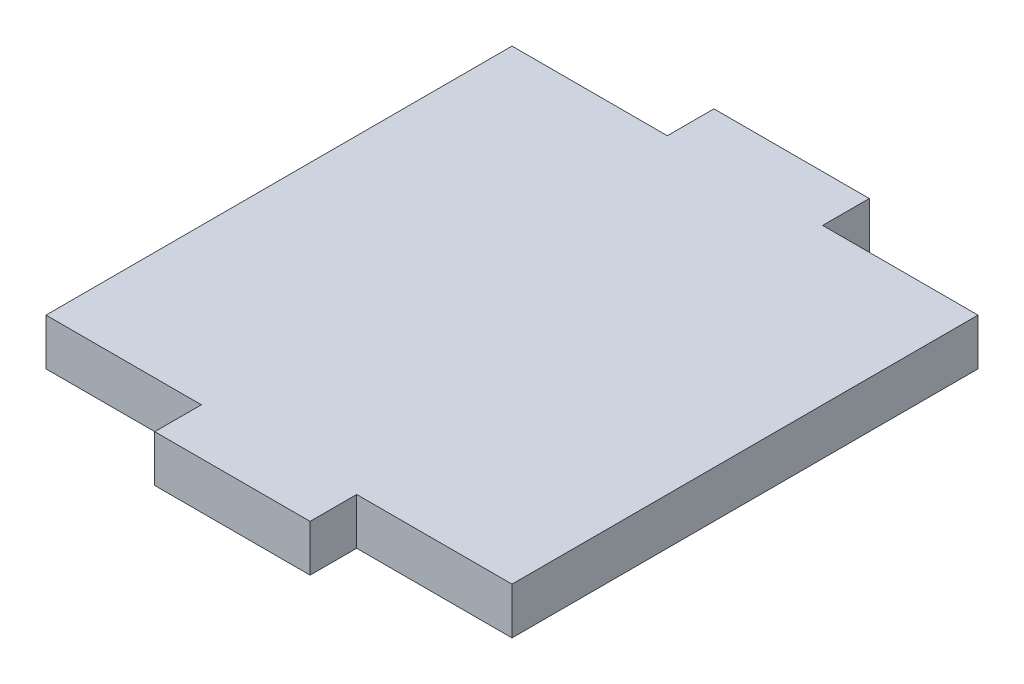
ISO-10303-21;
HEADER;
FILE_DESCRIPTION(('STEP AP214'),'2;1');
FILE_NAME('part.step','',(''),(''),'','','');
FILE_SCHEMA(('AUTOMOTIVE_DESIGN { 1 0 10303 214 1 1 1 1 }'));
ENDSEC;
DATA;
#1=APPLICATION_CONTEXT('core data for automotive mechanical design processes');
#2=APPLICATION_PROTOCOL_DEFINITION('international standard','automotive_design',2000,#1);
#3=PRODUCT_CONTEXT('',#1,'mechanical');
#4=PRODUCT('Part','Part','',(#3));
#5=PRODUCT_RELATED_PRODUCT_CATEGORY('part','',(#4));
#6=PRODUCT_DEFINITION_FORMATION('','',#4);
#7=PRODUCT_DEFINITION_CONTEXT('part definition',#1,'design');
#8=PRODUCT_DEFINITION('design','',#6,#7);
#9=PRODUCT_DEFINITION_SHAPE('','',#8);
#10=(LENGTH_UNIT() NAMED_UNIT(*) SI_UNIT(.MILLI.,.METRE.));
#11=(NAMED_UNIT(*) PLANE_ANGLE_UNIT() SI_UNIT($,.RADIAN.));
#12=(NAMED_UNIT(*) SI_UNIT($,.STERADIAN.) SOLID_ANGLE_UNIT());
#13=UNCERTAINTY_MEASURE_WITH_UNIT(LENGTH_MEASURE(1.E-05),#10,'distance_accuracy_value','');
#14=(GEOMETRIC_REPRESENTATION_CONTEXT(3) GLOBAL_UNCERTAINTY_ASSIGNED_CONTEXT((#13)) GLOBAL_UNIT_ASSIGNED_CONTEXT((#10,
#11,#12)) REPRESENTATION_CONTEXT('',''));
#15=CARTESIAN_POINT('',(0.,0.,0.));
#16=DIRECTION('',(0.,0.,1.));
#17=DIRECTION('',(1.,0.,0.));
#18=AXIS2_PLACEMENT_3D('',#15,#16,#17);
#19=CARTESIAN_POINT('',(4.99999999999999,3.,-15.));
#20=DIRECTION('',(0.,0.,1.));
#21=DIRECTION('',(1.,0.,0.));
#22=AXIS2_PLACEMENT_3D('',#19,#20,#21);
#23=PLANE('',#22);
#24=DIRECTION('',(-1.,0.,0.));
#25=VECTOR('',#24,1.);
#26=CARTESIAN_POINT('',(4.99999999999999,0.,-15.));
#27=LINE('',#26,#25);
#28=CARTESIAN_POINT('',(15.,0.,-15.));
#29=VERTEX_POINT('',#28);
#30=CARTESIAN_POINT('',(4.99999999999999,0.,-15.));
#31=VERTEX_POINT('',#30);
#32=EDGE_CURVE('E154',#29,#31,#27,.T.);
#33=ORIENTED_EDGE('',*,*,#32,.T.);
#34=DIRECTION('',(0.,-1.,0.));
#35=VECTOR('',#34,1.);
#36=CARTESIAN_POINT('',(4.99999999999999,3.,-15.));
#37=LINE('',#36,#35);
#38=CARTESIAN_POINT('',(4.99999999999999,3.,-15.));
#39=VERTEX_POINT('',#38);
#40=EDGE_CURVE('E11',#39,#31,#37,.T.);
#41=ORIENTED_EDGE('',*,*,#40,.F.);
#42=DIRECTION('',(-1.,0.,0.));
#43=VECTOR('',#42,1.);
#44=CARTESIAN_POINT('',(4.99999999999999,3.,-15.));
#45=LINE('',#44,#43);
#46=CARTESIAN_POINT('',(15.,3.,-15.));
#47=VERTEX_POINT('',#46);
#48=EDGE_CURVE('E176',#47,#39,#45,.T.);
#49=ORIENTED_EDGE('',*,*,#48,.F.);
#50=DIRECTION('',(0.,-1.,0.));
#51=VECTOR('',#50,1.);
#52=CARTESIAN_POINT('',(15.,3.,-15.));
#53=LINE('',#52,#51);
#54=EDGE_CURVE('E150',#47,#29,#53,.T.);
#55=ORIENTED_EDGE('',*,*,#54,.T.);
#56=EDGE_LOOP('',(#33,#41,#49,#55));
#57=FACE_BOUND('',#56,.T.);
#58=ADVANCED_FACE('F34',(#57),#23,.F.);
#59=CARTESIAN_POINT('',(4.99999999999999,3.,-15.));
#60=DIRECTION('',(-1.,0.,0.));
#61=DIRECTION('',(0.,0.,1.));
#62=AXIS2_PLACEMENT_3D('',#59,#60,#61);
#63=PLANE('',#62);
#64=DIRECTION('',(0.,0.,-1.));
#65=VECTOR('',#64,1.);
#66=CARTESIAN_POINT('',(4.99999999999999,0.,-15.));
#67=LINE('',#66,#65);
#68=CARTESIAN_POINT('',(4.99999999999999,0.,-18.));
#69=VERTEX_POINT('',#68);
#70=EDGE_CURVE('E157',#31,#69,#67,.T.);
#71=ORIENTED_EDGE('',*,*,#70,.T.);
#72=DIRECTION('',(0.,-1.,0.));
#73=VECTOR('',#72,1.);
#74=CARTESIAN_POINT('',(4.99999999999999,3.,-18.));
#75=LINE('',#74,#73);
#76=CARTESIAN_POINT('',(4.99999999999999,3.,-18.));
#77=VERTEX_POINT('',#76);
#78=EDGE_CURVE('E42',#77,#69,#75,.T.);
#79=ORIENTED_EDGE('',*,*,#78,.F.);
#80=DIRECTION('',(0.,0.,-1.));
#81=VECTOR('',#80,1.);
#82=CARTESIAN_POINT('',(4.99999999999999,3.,-15.));
#83=LINE('',#82,#81);
#84=EDGE_CURVE('E105',#39,#77,#83,.T.);
#85=ORIENTED_EDGE('',*,*,#84,.F.);
#86=ORIENTED_EDGE('',*,*,#40,.T.);
#87=EDGE_LOOP('',(#71,#79,#85,#86));
#88=FACE_BOUND('',#87,.T.);
#89=ADVANCED_FACE('F254',(#88),#63,.F.);
#90=CARTESIAN_POINT('',(4.99999999999999,3.,-18.));
#91=DIRECTION('',(0.,0.,1.));
#92=DIRECTION('',(1.,0.,0.));
#93=AXIS2_PLACEMENT_3D('',#90,#91,#92);
#94=PLANE('',#93);
#95=DIRECTION('',(-1.,0.,0.));
#96=VECTOR('',#95,1.);
#97=CARTESIAN_POINT('',(4.99999999999999,0.,-18.));
#98=LINE('',#97,#96);
#99=CARTESIAN_POINT('',(-5.00000000000001,0.,-18.));
#100=VERTEX_POINT('',#99);
#101=EDGE_CURVE('E159',#69,#100,#98,.T.);
#102=ORIENTED_EDGE('',*,*,#101,.T.);
#103=DIRECTION('',(0.,-1.,0.));
#104=VECTOR('',#103,1.);
#105=CARTESIAN_POINT('',(-5.00000000000001,3.,-18.));
#106=LINE('',#105,#104);
#107=CARTESIAN_POINT('',(-5.00000000000001,3.,-18.));
#108=VERTEX_POINT('',#107);
#109=EDGE_CURVE('E195',#108,#100,#106,.T.);
#110=ORIENTED_EDGE('',*,*,#109,.F.);
#111=DIRECTION('',(-1.,0.,0.));
#112=VECTOR('',#111,1.);
#113=CARTESIAN_POINT('',(4.99999999999999,3.,-18.));
#114=LINE('',#113,#112);
#115=EDGE_CURVE('E203',#77,#108,#114,.T.);
#116=ORIENTED_EDGE('',*,*,#115,.F.);
#117=ORIENTED_EDGE('',*,*,#78,.T.);
#118=EDGE_LOOP('',(#102,#110,#116,#117));
#119=FACE_BOUND('',#118,.T.);
#120=ADVANCED_FACE('F201',(#119),#94,.F.);
#121=CARTESIAN_POINT('',(-5.00000000000001,3.,-18.));
#122=DIRECTION('',(1.,0.,0.));
#123=DIRECTION('',(0.,0.,-1.));
#124=AXIS2_PLACEMENT_3D('',#121,#122,#123);
#125=PLANE('',#124);
#126=DIRECTION('',(0.,0.,1.));
#127=VECTOR('',#126,1.);
#128=CARTESIAN_POINT('',(-5.00000000000001,0.,-18.));
#129=LINE('',#128,#127);
#130=CARTESIAN_POINT('',(-5.00000000000001,0.,-15.));
#131=VERTEX_POINT('',#130);
#132=EDGE_CURVE('E161',#100,#131,#129,.T.);
#133=ORIENTED_EDGE('',*,*,#132,.T.);
#134=DIRECTION('',(0.,-1.,0.));
#135=VECTOR('',#134,1.);
#136=CARTESIAN_POINT('',(-5.00000000000001,3.,-15.));
#137=LINE('',#136,#135);
#138=CARTESIAN_POINT('',(-5.00000000000001,3.,-15.));
#139=VERTEX_POINT('',#138);
#140=EDGE_CURVE('E192',#139,#131,#137,.T.);
#141=ORIENTED_EDGE('',*,*,#140,.F.);
#142=DIRECTION('',(0.,0.,1.));
#143=VECTOR('',#142,1.);
#144=CARTESIAN_POINT('',(-5.00000000000001,3.,-18.));
#145=LINE('',#144,#143);
#146=EDGE_CURVE('E221',#108,#139,#145,.T.);
#147=ORIENTED_EDGE('',*,*,#146,.F.);
#148=ORIENTED_EDGE('',*,*,#109,.T.);
#149=EDGE_LOOP('',(#133,#141,#147,#148));
#150=FACE_BOUND('',#149,.T.);
#151=ADVANCED_FACE('F212',(#150),#125,.F.);
#152=CARTESIAN_POINT('',(-15.,3.,-15.));
#153=DIRECTION('',(0.,0.,1.));
#154=DIRECTION('',(1.,0.,0.));
#155=AXIS2_PLACEMENT_3D('',#152,#153,#154);
#156=PLANE('',#155);
#157=DIRECTION('',(-1.,0.,0.));
#158=VECTOR('',#157,1.);
#159=CARTESIAN_POINT('',(-15.,0.,-15.));
#160=LINE('',#159,#158);
#161=CARTESIAN_POINT('',(-15.,0.,-15.));
#162=VERTEX_POINT('',#161);
#163=EDGE_CURVE('E163',#131,#162,#160,.T.);
#164=ORIENTED_EDGE('',*,*,#163,.T.);
#165=DIRECTION('',(0.,-1.,0.));
#166=VECTOR('',#165,1.);
#167=CARTESIAN_POINT('',(-15.,3.,-15.));
#168=LINE('',#167,#166);
#169=CARTESIAN_POINT('',(-15.,3.,-15.));
#170=VERTEX_POINT('',#169);
#171=EDGE_CURVE('E189',#170,#162,#168,.T.);
#172=ORIENTED_EDGE('',*,*,#171,.F.);
#173=DIRECTION('',(-1.,0.,0.));
#174=VECTOR('',#173,1.);
#175=CARTESIAN_POINT('',(-15.,3.,-15.));
#176=LINE('',#175,#174);
#177=EDGE_CURVE('E218',#139,#170,#176,.T.);
#178=ORIENTED_EDGE('',*,*,#177,.F.);
#179=ORIENTED_EDGE('',*,*,#140,.T.);
#180=EDGE_LOOP('',(#164,#172,#178,#179));
#181=FACE_BOUND('',#180,.T.);
#182=ADVANCED_FACE('F216',(#181),#156,.F.);
#183=CARTESIAN_POINT('',(-15.,3.,15.));
#184=DIRECTION('',(1.,0.,0.));
#185=DIRECTION('',(0.,0.,-1.));
#186=AXIS2_PLACEMENT_3D('',#183,#184,#185);
#187=PLANE('',#186);
#188=DIRECTION('',(0.,0.,1.));
#189=VECTOR('',#188,1.);
#190=CARTESIAN_POINT('',(-15.,0.,15.));
#191=LINE('',#190,#189);
#192=CARTESIAN_POINT('',(-15.,0.,15.));
#193=VERTEX_POINT('',#192);
#194=EDGE_CURVE('E165',#162,#193,#191,.T.);
#195=ORIENTED_EDGE('',*,*,#194,.T.);
#196=DIRECTION('',(0.,-1.,0.));
#197=VECTOR('',#196,1.);
#198=CARTESIAN_POINT('',(-15.,3.,15.));
#199=LINE('',#198,#197);
#200=CARTESIAN_POINT('',(-15.,3.,15.));
#201=VERTEX_POINT('',#200);
#202=EDGE_CURVE('E186',#201,#193,#199,.T.);
#203=ORIENTED_EDGE('',*,*,#202,.F.);
#204=DIRECTION('',(0.,0.,1.));
#205=VECTOR('',#204,1.);
#206=CARTESIAN_POINT('',(-15.,3.,15.));
#207=LINE('',#206,#205);
#208=EDGE_CURVE('E220',#170,#201,#207,.T.);
#209=ORIENTED_EDGE('',*,*,#208,.F.);
#210=ORIENTED_EDGE('',*,*,#171,.T.);
#211=EDGE_LOOP('',(#195,#203,#209,#210));
#212=FACE_BOUND('',#211,.T.);
#213=ADVANCED_FACE('F267',(#212),#187,.F.);
#214=CARTESIAN_POINT('',(-15.,3.,15.));
#215=DIRECTION('',(0.,0.,-1.));
#216=DIRECTION('',(-1.,0.,0.));
#217=AXIS2_PLACEMENT_3D('',#214,#215,#216);
#218=PLANE('',#217);
#219=DIRECTION('',(1.,0.,0.));
#220=VECTOR('',#219,1.);
#221=CARTESIAN_POINT('',(-15.,0.,15.));
#222=LINE('',#221,#220);
#223=CARTESIAN_POINT('',(-4.99999999999999,0.,15.));
#224=VERTEX_POINT('',#223);
#225=EDGE_CURVE('E167',#193,#224,#222,.T.);
#226=ORIENTED_EDGE('',*,*,#225,.T.);
#227=DIRECTION('',(0.,-1.,0.));
#228=VECTOR('',#227,1.);
#229=CARTESIAN_POINT('',(-4.99999999999999,3.,15.));
#230=LINE('',#229,#228);
#231=CARTESIAN_POINT('',(-4.99999999999999,3.,15.));
#232=VERTEX_POINT('',#231);
#233=EDGE_CURVE('E183',#232,#224,#230,.T.);
#234=ORIENTED_EDGE('',*,*,#233,.F.);
#235=DIRECTION('',(1.,0.,0.));
#236=VECTOR('',#235,1.);
#237=CARTESIAN_POINT('',(-15.,3.,15.));
#238=LINE('',#237,#236);
#239=EDGE_CURVE('E223',#201,#232,#238,.T.);
#240=ORIENTED_EDGE('',*,*,#239,.F.);
#241=ORIENTED_EDGE('',*,*,#202,.T.);
#242=EDGE_LOOP('',(#226,#234,#240,#241));
#243=FACE_BOUND('',#242,.T.);
#244=ADVANCED_FACE('F270',(#243),#218,.F.);
#245=CARTESIAN_POINT('',(-4.99999999999999,3.,18.));
#246=DIRECTION('',(1.,0.,0.));
#247=DIRECTION('',(0.,0.,-1.));
#248=AXIS2_PLACEMENT_3D('',#245,#246,#247);
#249=PLANE('',#248);
#250=DIRECTION('',(0.,0.,1.));
#251=VECTOR('',#250,1.);
#252=CARTESIAN_POINT('',(-4.99999999999999,0.,18.));
#253=LINE('',#252,#251);
#254=CARTESIAN_POINT('',(-4.99999999999999,0.,18.));
#255=VERTEX_POINT('',#254);
#256=EDGE_CURVE('E169',#224,#255,#253,.T.);
#257=ORIENTED_EDGE('',*,*,#256,.T.);
#258=DIRECTION('',(0.,-1.,0.));
#259=VECTOR('',#258,1.);
#260=CARTESIAN_POINT('',(-4.99999999999999,3.,18.));
#261=LINE('',#260,#259);
#262=CARTESIAN_POINT('',(-4.99999999999999,3.,18.));
#263=VERTEX_POINT('',#262);
#264=EDGE_CURVE('E180',#263,#255,#261,.T.);
#265=ORIENTED_EDGE('',*,*,#264,.F.);
#266=DIRECTION('',(0.,0.,1.));
#267=VECTOR('',#266,1.);
#268=CARTESIAN_POINT('',(-4.99999999999999,3.,18.));
#269=LINE('',#268,#267);
#270=EDGE_CURVE('E229',#232,#263,#269,.T.);
#271=ORIENTED_EDGE('',*,*,#270,.F.);
#272=ORIENTED_EDGE('',*,*,#233,.T.);
#273=EDGE_LOOP('',(#257,#265,#271,#272));
#274=FACE_BOUND('',#273,.T.);
#275=ADVANCED_FACE('F235',(#274),#249,.F.);
#276=CARTESIAN_POINT('',(5.,3.,18.));
#277=DIRECTION('',(0.,0.,-1.));
#278=DIRECTION('',(-1.,0.,0.));
#279=AXIS2_PLACEMENT_3D('',#276,#277,#278);
#280=PLANE('',#279);
#281=DIRECTION('',(1.,0.,0.));
#282=VECTOR('',#281,1.);
#283=CARTESIAN_POINT('',(5.,0.,18.));
#284=LINE('',#283,#282);
#285=CARTESIAN_POINT('',(5.,0.,18.));
#286=VERTEX_POINT('',#285);
#287=EDGE_CURVE('E171',#255,#286,#284,.T.);
#288=ORIENTED_EDGE('',*,*,#287,.T.);
#289=DIRECTION('',(0.,-1.,0.));
#290=VECTOR('',#289,1.);
#291=CARTESIAN_POINT('',(5.,3.,18.));
#292=LINE('',#291,#290);
#293=CARTESIAN_POINT('',(5.,3.,18.));
#294=VERTEX_POINT('',#293);
#295=EDGE_CURVE('E145',#294,#286,#292,.T.);
#296=ORIENTED_EDGE('',*,*,#295,.F.);
#297=DIRECTION('',(1.,0.,0.));
#298=VECTOR('',#297,1.);
#299=CARTESIAN_POINT('',(5.,3.,18.));
#300=LINE('',#299,#298);
#301=EDGE_CURVE('E136',#263,#294,#300,.T.);
#302=ORIENTED_EDGE('',*,*,#301,.F.);
#303=ORIENTED_EDGE('',*,*,#264,.T.);
#304=EDGE_LOOP('',(#288,#296,#302,#303));
#305=FACE_BOUND('',#304,.T.);
#306=ADVANCED_FACE('F239',(#305),#280,.F.);
#307=CARTESIAN_POINT('',(5.,3.,15.));
#308=DIRECTION('',(-1.,0.,0.));
#309=DIRECTION('',(0.,0.,1.));
#310=AXIS2_PLACEMENT_3D('',#307,#308,#309);
#311=PLANE('',#310);
#312=DIRECTION('',(0.,0.,-1.));
#313=VECTOR('',#312,1.);
#314=CARTESIAN_POINT('',(5.,0.,15.));
#315=LINE('',#314,#313);
#316=CARTESIAN_POINT('',(5.,0.,15.));
#317=VERTEX_POINT('',#316);
#318=EDGE_CURVE('E144',#286,#317,#315,.T.);
#319=ORIENTED_EDGE('',*,*,#318,.T.);
#320=DIRECTION('',(0.,-1.,0.));
#321=VECTOR('',#320,1.);
#322=CARTESIAN_POINT('',(5.,3.,15.));
#323=LINE('',#322,#321);
#324=CARTESIAN_POINT('',(5.,3.,15.));
#325=VERTEX_POINT('',#324);
#326=EDGE_CURVE('E141',#325,#317,#323,.T.);
#327=ORIENTED_EDGE('',*,*,#326,.F.);
#328=DIRECTION('',(0.,0.,-1.));
#329=VECTOR('',#328,1.);
#330=CARTESIAN_POINT('',(5.,3.,15.));
#331=LINE('',#330,#329);
#332=EDGE_CURVE('E130',#294,#325,#331,.T.);
#333=ORIENTED_EDGE('',*,*,#332,.F.);
#334=ORIENTED_EDGE('',*,*,#295,.T.);
#335=EDGE_LOOP('',(#319,#327,#333,#334));
#336=FACE_BOUND('',#335,.T.);
#337=ADVANCED_FACE('F142',(#336),#311,.F.);
#338=CARTESIAN_POINT('',(5.,3.,15.));
#339=DIRECTION('',(0.,0.,-1.));
#340=DIRECTION('',(-1.,0.,0.));
#341=AXIS2_PLACEMENT_3D('',#338,#339,#340);
#342=PLANE('',#341);
#343=DIRECTION('',(1.,0.,0.));
#344=VECTOR('',#343,1.);
#345=CARTESIAN_POINT('',(5.,0.,15.));
#346=LINE('',#345,#344);
#347=CARTESIAN_POINT('',(15.,0.,15.));
#348=VERTEX_POINT('',#347);
#349=EDGE_CURVE('E91',#317,#348,#346,.T.);
#350=ORIENTED_EDGE('',*,*,#349,.T.);
#351=DIRECTION('',(0.,-1.,0.));
#352=VECTOR('',#351,1.);
#353=CARTESIAN_POINT('',(15.,3.,15.));
#354=LINE('',#353,#352);
#355=CARTESIAN_POINT('',(15.,3.,15.));
#356=VERTEX_POINT('',#355);
#357=EDGE_CURVE('E146',#356,#348,#354,.T.);
#358=ORIENTED_EDGE('',*,*,#357,.F.);
#359=DIRECTION('',(1.,0.,0.));
#360=VECTOR('',#359,1.);
#361=CARTESIAN_POINT('',(5.,3.,15.));
#362=LINE('',#361,#360);
#363=EDGE_CURVE('E134',#325,#356,#362,.T.);
#364=ORIENTED_EDGE('',*,*,#363,.F.);
#365=ORIENTED_EDGE('',*,*,#326,.T.);
#366=EDGE_LOOP('',(#350,#358,#364,#365));
#367=FACE_BOUND('',#366,.T.);
#368=ADVANCED_FACE('F148',(#367),#342,.F.);
#369=CARTESIAN_POINT('',(15.,3.,15.));
#370=DIRECTION('',(-1.,0.,0.));
#371=DIRECTION('',(0.,0.,1.));
#372=AXIS2_PLACEMENT_3D('',#369,#370,#371);
#373=PLANE('',#372);
#374=DIRECTION('',(0.,0.,-1.));
#375=VECTOR('',#374,1.);
#376=CARTESIAN_POINT('',(15.,0.,15.));
#377=LINE('',#376,#375);
#378=EDGE_CURVE('E97',#348,#29,#377,.T.);
#379=ORIENTED_EDGE('',*,*,#378,.T.);
#380=ORIENTED_EDGE('',*,*,#54,.F.);
#381=DIRECTION('',(0.,0.,-1.));
#382=VECTOR('',#381,1.);
#383=CARTESIAN_POINT('',(15.,3.,15.));
#384=LINE('',#383,#382);
#385=EDGE_CURVE('E50',#356,#47,#384,.T.);
#386=ORIENTED_EDGE('',*,*,#385,.F.);
#387=ORIENTED_EDGE('',*,*,#357,.T.);
#388=EDGE_LOOP('',(#379,#380,#386,#387));
#389=FACE_BOUND('',#388,.T.);
#390=ADVANCED_FACE('F243',(#389),#373,.F.);
#391=CARTESIAN_POINT('',(0.,3.,0.));
#392=DIRECTION('',(0.,1.,0.));
#393=DIRECTION('',(0.,0.,1.));
#394=AXIS2_PLACEMENT_3D('',#391,#392,#393);
#395=PLANE('',#394);
#396=ORIENTED_EDGE('',*,*,#48,.T.);
#397=ORIENTED_EDGE('',*,*,#84,.T.);
#398=ORIENTED_EDGE('',*,*,#115,.T.);
#399=ORIENTED_EDGE('',*,*,#146,.T.);
#400=ORIENTED_EDGE('',*,*,#177,.T.);
#401=ORIENTED_EDGE('',*,*,#208,.T.);
#402=ORIENTED_EDGE('',*,*,#239,.T.);
#403=ORIENTED_EDGE('',*,*,#270,.T.);
#404=ORIENTED_EDGE('',*,*,#301,.T.);
#405=ORIENTED_EDGE('',*,*,#332,.T.);
#406=ORIENTED_EDGE('',*,*,#363,.T.);
#407=ORIENTED_EDGE('',*,*,#385,.T.);
#408=EDGE_LOOP('',(#396,#397,#398,#399,#400,#401,#402,#403,#404,#405,#406,#407));
#409=FACE_BOUND('',#408,.T.);
#410=ADVANCED_FACE('F132',(#409),#395,.T.);
#411=CARTESIAN_POINT('',(0.,0.,0.));
#412=DIRECTION('',(0.,1.,0.));
#413=DIRECTION('',(0.,0.,1.));
#414=AXIS2_PLACEMENT_3D('',#411,#412,#413);
#415=PLANE('',#414);
#416=ORIENTED_EDGE('',*,*,#32,.F.);
#417=ORIENTED_EDGE('',*,*,#378,.F.);
#418=ORIENTED_EDGE('',*,*,#349,.F.);
#419=ORIENTED_EDGE('',*,*,#318,.F.);
#420=ORIENTED_EDGE('',*,*,#287,.F.);
#421=ORIENTED_EDGE('',*,*,#256,.F.);
#422=ORIENTED_EDGE('',*,*,#225,.F.);
#423=ORIENTED_EDGE('',*,*,#194,.F.);
#424=ORIENTED_EDGE('',*,*,#163,.F.);
#425=ORIENTED_EDGE('',*,*,#132,.F.);
#426=ORIENTED_EDGE('',*,*,#101,.F.);
#427=ORIENTED_EDGE('',*,*,#70,.F.);
#428=EDGE_LOOP('',(#416,#417,#418,#419,#420,#421,#422,#423,#424,#425,#426,#427));
#429=FACE_BOUND('',#428,.T.);
#430=ADVANCED_FACE('F207',(#429),#415,.F.);
#431=CLOSED_SHELL('',(#58,#89,#120,#151,#182,#213,#244,#275,#306,#337,#368,#390,#410,#430));
#432=MANIFOLD_SOLID_BREP('B2',#431);
#433=ADVANCED_BREP_SHAPE_REPRESENTATION('',(#18,#432),#14);
#434=SHAPE_DEFINITION_REPRESENTATION(#9,#433);
ENDSEC;
END-ISO-10303-21;
